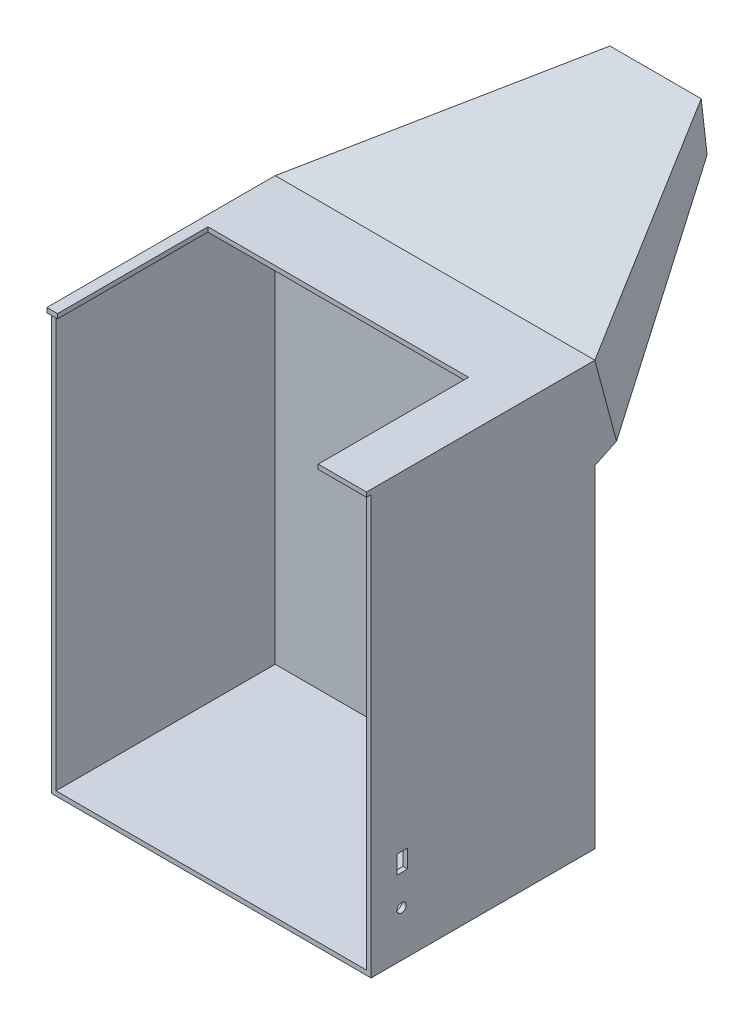
ISO-10303-21;
HEADER;
FILE_DESCRIPTION(('STEP AP214'),'2;1');
FILE_NAME('part.step','',(''),(''),'','','');
FILE_SCHEMA(('AUTOMOTIVE_DESIGN { 1 0 10303 214 1 1 1 1 }'));
ENDSEC;
DATA;
#1=APPLICATION_CONTEXT('core data for automotive mechanical design processes');
#2=APPLICATION_PROTOCOL_DEFINITION('international standard','automotive_design',2000,#1);
#3=PRODUCT_CONTEXT('',#1,'mechanical');
#4=PRODUCT('Part','Part','',(#3));
#5=PRODUCT_RELATED_PRODUCT_CATEGORY('part','',(#4));
#6=PRODUCT_DEFINITION_FORMATION('','',#4);
#7=PRODUCT_DEFINITION_CONTEXT('part definition',#1,'design');
#8=PRODUCT_DEFINITION('design','',#6,#7);
#9=PRODUCT_DEFINITION_SHAPE('','',#8);
#10=(LENGTH_UNIT() NAMED_UNIT(*) SI_UNIT(.MILLI.,.METRE.));
#11=(NAMED_UNIT(*) PLANE_ANGLE_UNIT() SI_UNIT($,.RADIAN.));
#12=(NAMED_UNIT(*) SI_UNIT($,.STERADIAN.) SOLID_ANGLE_UNIT());
#13=UNCERTAINTY_MEASURE_WITH_UNIT(LENGTH_MEASURE(1.E-05),#10,'distance_accuracy_value','');
#14=(GEOMETRIC_REPRESENTATION_CONTEXT(3) GLOBAL_UNCERTAINTY_ASSIGNED_CONTEXT((#13)) GLOBAL_UNIT_ASSIGNED_CONTEXT((#10,
#11,#12)) REPRESENTATION_CONTEXT('',''));
#15=CARTESIAN_POINT('',(0.,0.,0.));
#16=DIRECTION('',(0.,0.,1.));
#17=DIRECTION('',(1.,0.,0.));
#18=AXIS2_PLACEMENT_3D('',#15,#16,#17);
#19=CARTESIAN_POINT('',(-55.1888092698929,275.,-87.4251345332221));
#20=DIRECTION('',(1.,0.,0.));
#21=DIRECTION('',(0.,0.,-1.));
#22=AXIS2_PLACEMENT_3D('',#19,#20,#21);
#23=PLANE('',#22);
#24=DIRECTION('',(0.,0.,1.));
#25=VECTOR('',#24,1.);
#26=CARTESIAN_POINT('',(-55.1888092698929,278.,62.5748654667794));
#27=LINE('',#26,#25);
#28=CARTESIAN_POINT('',(-55.1888092698929,278.,-87.425134533222));
#29=VERTEX_POINT('',#28);
#30=CARTESIAN_POINT('',(-55.1888092698929,278.,62.5748654667794));
#31=VERTEX_POINT('',#30);
#32=EDGE_CURVE('E250',#29,#31,#27,.T.);
#33=ORIENTED_EDGE('',*,*,#32,.F.);
#34=DIRECTION('',(0.,0.965925826289068,0.258819045102521));
#35=VECTOR('',#34,1.);
#36=CARTESIAN_POINT('',(-55.1888092698929,75.1555764792956,-141.777134004752));
#37=LINE('',#36,#35);
#38=CARTESIAN_POINT('',(-55.1888092698929,224.774397794057,-101.686891660965));
#39=VERTEX_POINT('',#38);
#40=EDGE_CURVE('E224',#39,#29,#37,.T.);
#41=ORIENTED_EDGE('',*,*,#40,.F.);
#42=DIRECTION('',(0.,-0.429060078344727,0.903275954053254));
#43=VECTOR('',#42,1.);
#44=CARTESIAN_POINT('',(-55.1888092698929,286.822856765378,-232.314008476582));
#45=LINE('',#44,#43);
#46=CARTESIAN_POINT('',(-55.1888092698929,218.,-87.425134533222));
#47=VERTEX_POINT('',#46);
#48=EDGE_CURVE('E235',#39,#47,#45,.T.);
#49=ORIENTED_EDGE('',*,*,#48,.T.);
#50=DIRECTION('',(0.,-1.,0.));
#51=VECTOR('',#50,1.);
#52=CARTESIAN_POINT('',(-55.1888092698929,275.,-87.4251345332221));
#53=LINE('',#52,#51);
#54=CARTESIAN_POINT('',(-55.1888092698929,0.,-87.4251345332221));
#55=VERTEX_POINT('',#54);
#56=EDGE_CURVE('E346',#47,#55,#53,.T.);
#57=ORIENTED_EDGE('',*,*,#56,.T.);
#58=DIRECTION('',(0.,0.,1.));
#59=VECTOR('',#58,1.);
#60=CARTESIAN_POINT('',(-55.1888092698929,0.,-87.4251345332221));
#61=LINE('',#60,#59);
#62=CARTESIAN_POINT('',(-55.1888092698928,0.,59.5748654667779));
#63=VERTEX_POINT('',#62);
#64=EDGE_CURVE('E329',#55,#63,#61,.T.);
#65=ORIENTED_EDGE('',*,*,#64,.T.);
#66=DIRECTION('',(0.,-1.,0.));
#67=VECTOR('',#66,1.);
#68=CARTESIAN_POINT('',(-55.1888092698928,275.,59.5748654667779));
#69=LINE('',#68,#67);
#70=CARTESIAN_POINT('',(-55.1888092698929,275.,59.5748654667779));
#71=VERTEX_POINT('',#70);
#72=EDGE_CURVE('E293',#71,#63,#69,.T.);
#73=ORIENTED_EDGE('',*,*,#72,.F.);
#74=DIRECTION('',(0.,0.,1.));
#75=VECTOR('',#74,1.);
#76=CARTESIAN_POINT('',(-55.1888092698929,275.,62.5748654667794));
#77=LINE('',#76,#75);
#78=CARTESIAN_POINT('',(-55.1888092698929,275.,62.5748654667794));
#79=VERTEX_POINT('',#78);
#80=EDGE_CURVE('E265',#71,#79,#77,.T.);
#81=ORIENTED_EDGE('',*,*,#80,.T.);
#82=DIRECTION('',(0.,-1.,0.));
#83=VECTOR('',#82,1.);
#84=CARTESIAN_POINT('',(-55.1888092698929,278.,62.5748654667794));
#85=LINE('',#84,#83);
#86=EDGE_CURVE('E290',#31,#79,#85,.T.);
#87=ORIENTED_EDGE('',*,*,#86,.F.);
#88=EDGE_LOOP('',(#33,#41,#49,#57,#65,#73,#81,#87));
#89=FACE_BOUND('',#88,.T.);
#90=ADVANCED_FACE('F35',(#89),#23,.F.);
#91=CARTESIAN_POINT('',(154.811190730107,275.,-87.4251345332221));
#92=DIRECTION('',(-1.,0.,0.));
#93=DIRECTION('',(0.,0.,1.));
#94=AXIS2_PLACEMENT_3D('',#91,#92,#93);
#95=PLANE('',#94);
#96=DIRECTION('',(0.,0.,-1.));
#97=VECTOR('',#96,1.);
#98=CARTESIAN_POINT('',(154.811190730107,50.,42.5748654667779));
#99=LINE('',#98,#97);
#100=CARTESIAN_POINT('',(154.811190730107,50.,42.5748654667779));
#101=VERTEX_POINT('',#100);
#102=CARTESIAN_POINT('',(154.811190730107,50.,35.5748654667779));
#103=VERTEX_POINT('',#102);
#104=EDGE_CURVE('E195',#101,#103,#99,.T.);
#105=ORIENTED_EDGE('',*,*,#104,.F.);
#106=DIRECTION('',(0.,-1.,0.));
#107=VECTOR('',#106,1.);
#108=CARTESIAN_POINT('',(154.811190730107,62.,42.5748654667779));
#109=LINE('',#108,#107);
#110=CARTESIAN_POINT('',(154.811190730107,62.,42.5748654667779));
#111=VERTEX_POINT('',#110);
#112=EDGE_CURVE('E49',#111,#101,#109,.T.);
#113=ORIENTED_EDGE('',*,*,#112,.F.);
#114=DIRECTION('',(0.,0.,1.));
#115=VECTOR('',#114,1.);
#116=CARTESIAN_POINT('',(154.811190730107,62.,42.5748654667779));
#117=LINE('',#116,#115);
#118=CARTESIAN_POINT('',(154.811190730107,62.,35.5748654667779));
#119=VERTEX_POINT('',#118);
#120=EDGE_CURVE('E202',#119,#111,#117,.T.);
#121=ORIENTED_EDGE('',*,*,#120,.F.);
#122=DIRECTION('',(0.,1.,0.));
#123=VECTOR('',#122,1.);
#124=CARTESIAN_POINT('',(154.811190730107,62.,35.5748654667779));
#125=LINE('',#124,#123);
#126=EDGE_CURVE('E186',#103,#119,#125,.T.);
#127=ORIENTED_EDGE('',*,*,#126,.F.);
#128=EDGE_LOOP('',(#105,#113,#121,#127));
#129=FACE_BOUND('',#128,.T.);
#130=CARTESIAN_POINT('',(154.811190730107,30.,39.5748654667779));
#131=DIRECTION('',(1.,0.,0.));
#132=DIRECTION('',(0.,0.,-1.));
#133=AXIS2_PLACEMENT_3D('',#130,#131,#132);
#134=CIRCLE('',#133,3.);
#135=CARTESIAN_POINT('',(154.811190730107,30.,36.5748654667779));
#136=VERTEX_POINT('',#135);
#137=EDGE_CURVE('E209',#136,#136,#134,.T.);
#138=ORIENTED_EDGE('',*,*,#137,.F.);
#139=EDGE_LOOP('',(#138));
#140=FACE_BOUND('',#139,.T.);
#141=DIRECTION('',(0.,0.429060078344727,-0.903275954053254));
#142=VECTOR('',#141,1.);
#143=CARTESIAN_POINT('',(154.811190730107,286.822856765378,-232.314008476582));
#144=LINE('',#143,#142);
#145=CARTESIAN_POINT('',(154.811190730107,218.,-87.4251345332221));
#146=VERTEX_POINT('',#145);
#147=CARTESIAN_POINT('',(154.811190730107,224.774397794057,-101.686891660965));
#148=VERTEX_POINT('',#147);
#149=EDGE_CURVE('E228',#146,#148,#144,.T.);
#150=ORIENTED_EDGE('',*,*,#149,.T.);
#151=DIRECTION('',(0.,0.965925826289068,0.258819045102521));
#152=VECTOR('',#151,1.);
#153=CARTESIAN_POINT('',(154.811190730107,75.1555764792956,-141.777134004752));
#154=LINE('',#153,#152);
#155=CARTESIAN_POINT('',(154.811190730107,278.,-87.425134533222));
#156=VERTEX_POINT('',#155);
#157=EDGE_CURVE('E217',#148,#156,#154,.T.);
#158=ORIENTED_EDGE('',*,*,#157,.T.);
#159=DIRECTION('',(0.,0.,-1.));
#160=VECTOR('',#159,1.);
#161=CARTESIAN_POINT('',(154.811190730106,278.,62.5748654667794));
#162=LINE('',#161,#160);
#163=CARTESIAN_POINT('',(154.811190730106,278.,62.5748654667794));
#164=VERTEX_POINT('',#163);
#165=EDGE_CURVE('E243',#164,#156,#162,.T.);
#166=ORIENTED_EDGE('',*,*,#165,.F.);
#167=DIRECTION('',(0.,-1.,0.));
#168=VECTOR('',#167,1.);
#169=CARTESIAN_POINT('',(154.811190730106,278.,62.5748654667794));
#170=LINE('',#169,#168);
#171=CARTESIAN_POINT('',(154.811190730106,275.,62.5748654667794));
#172=VERTEX_POINT('',#171);
#173=EDGE_CURVE('E262',#164,#172,#170,.T.);
#174=ORIENTED_EDGE('',*,*,#173,.T.);
#175=DIRECTION('',(0.,0.,-1.));
#176=VECTOR('',#175,1.);
#177=CARTESIAN_POINT('',(154.811190730106,275.,62.5748654667794));
#178=LINE('',#177,#176);
#179=CARTESIAN_POINT('',(154.811190730106,275.,59.5748654667779));
#180=VERTEX_POINT('',#179);
#181=EDGE_CURVE('E242',#172,#180,#178,.T.);
#182=ORIENTED_EDGE('',*,*,#181,.T.);
#183=DIRECTION('',(0.,1.,0.));
#184=VECTOR('',#183,1.);
#185=CARTESIAN_POINT('',(154.811190730107,275.,59.5748654667779));
#186=LINE('',#185,#184);
#187=CARTESIAN_POINT('',(154.811190730107,0.,59.5748654667779));
#188=VERTEX_POINT('',#187);
#189=EDGE_CURVE('E297',#188,#180,#186,.T.);
#190=ORIENTED_EDGE('',*,*,#189,.F.);
#191=DIRECTION('',(0.,0.,-1.));
#192=VECTOR('',#191,1.);
#193=CARTESIAN_POINT('',(154.811190730107,0.,-87.4251345332221));
#194=LINE('',#193,#192);
#195=CARTESIAN_POINT('',(154.811190730107,0.,-87.4251345332221));
#196=VERTEX_POINT('',#195);
#197=EDGE_CURVE('E340',#188,#196,#194,.T.);
#198=ORIENTED_EDGE('',*,*,#197,.T.);
#199=DIRECTION('',(0.,-1.,0.));
#200=VECTOR('',#199,1.);
#201=CARTESIAN_POINT('',(154.811190730107,275.,-87.4251345332221));
#202=LINE('',#201,#200);
#203=EDGE_CURVE('E348',#146,#196,#202,.T.);
#204=ORIENTED_EDGE('',*,*,#203,.F.);
#205=EDGE_LOOP('',(#150,#158,#166,#174,#182,#190,#198,#204));
#206=FACE_BOUND('',#205,.T.);
#207=ADVANCED_FACE('F199',(#129,#140,#206),#95,.F.);
#208=CARTESIAN_POINT('',(0.,0.,0.));
#209=DIRECTION('',(0.,1.,0.));
#210=DIRECTION('',(0.,0.,1.));
#211=AXIS2_PLACEMENT_3D('',#208,#209,#210);
#212=PLANE('',#211);
#213=DIRECTION('',(1.,0.,0.));
#214=VECTOR('',#213,1.);
#215=CARTESIAN_POINT('',(-55.1888092698928,0.,59.5748654667779));
#216=LINE('',#215,#214);
#217=EDGE_CURVE('E295',#63,#188,#216,.T.);
#218=ORIENTED_EDGE('',*,*,#217,.F.);
#219=ORIENTED_EDGE('',*,*,#64,.F.);
#220=DIRECTION('',(-1.,0.,0.));
#221=VECTOR('',#220,1.);
#222=CARTESIAN_POINT('',(-55.1888092698929,0.,-87.4251345332221));
#223=LINE('',#222,#221);
#224=EDGE_CURVE('E343',#196,#55,#223,.T.);
#225=ORIENTED_EDGE('',*,*,#224,.F.);
#226=ORIENTED_EDGE('',*,*,#197,.F.);
#227=EDGE_LOOP('',(#218,#219,#225,#226));
#228=FACE_BOUND('',#227,.T.);
#229=ADVANCED_FACE('F384',(#228),#212,.F.);
#230=CARTESIAN_POINT('',(-55.1888092698929,275.,-87.4251345332221));
#231=DIRECTION('',(0.,0.,1.));
#232=DIRECTION('',(1.,0.,0.));
#233=AXIS2_PLACEMENT_3D('',#230,#231,#232);
#234=PLANE('',#233);
#235=ORIENTED_EDGE('',*,*,#56,.F.);
#236=DIRECTION('',(1.,0.,0.));
#237=VECTOR('',#236,1.);
#238=CARTESIAN_POINT('',(-230.570515305173,218.,-87.425134533222));
#239=LINE('',#238,#237);
#240=EDGE_CURVE('E231',#47,#146,#239,.T.);
#241=ORIENTED_EDGE('',*,*,#240,.T.);
#242=ORIENTED_EDGE('',*,*,#203,.T.);
#243=ORIENTED_EDGE('',*,*,#224,.T.);
#244=EDGE_LOOP('',(#235,#241,#242,#243));
#245=FACE_BOUND('',#244,.T.);
#246=ADVANCED_FACE('F417',(#245),#234,.F.);
#247=CARTESIAN_POINT('',(-52.1888092698929,3.,-84.4251345332221));
#248=DIRECTION('',(-1.,0.,0.));
#249=DIRECTION('',(0.,0.,1.));
#250=AXIS2_PLACEMENT_3D('',#247,#248,#249);
#251=PLANE('',#250);
#252=DIRECTION('',(0.,0.,1.));
#253=VECTOR('',#252,1.);
#254=CARTESIAN_POINT('',(-52.1888092698929,275.,-84.4251345332221));
#255=LINE('',#254,#253);
#256=CARTESIAN_POINT('',(-52.1888092698929,275.,-84.4251345332221));
#257=VERTEX_POINT('',#256);
#258=CARTESIAN_POINT('',(-52.1888092698928,275.,59.5748654667779));
#259=VERTEX_POINT('',#258);
#260=EDGE_CURVE('E304',#257,#259,#255,.T.);
#261=ORIENTED_EDGE('',*,*,#260,.T.);
#262=DIRECTION('',(0.,1.,0.));
#263=VECTOR('',#262,1.);
#264=CARTESIAN_POINT('',(-52.1888092698928,3.,59.5748654667779));
#265=LINE('',#264,#263);
#266=CARTESIAN_POINT('',(-52.1888092698929,3.,59.5748654667779));
#267=VERTEX_POINT('',#266);
#268=EDGE_CURVE('E318',#267,#259,#265,.T.);
#269=ORIENTED_EDGE('',*,*,#268,.F.);
#270=DIRECTION('',(0.,0.,1.));
#271=VECTOR('',#270,1.);
#272=CARTESIAN_POINT('',(-52.1888092698929,3.,-84.4251345332221));
#273=LINE('',#272,#271);
#274=CARTESIAN_POINT('',(-52.1888092698929,3.,-84.4251345332221));
#275=VERTEX_POINT('',#274);
#276=EDGE_CURVE('E305',#275,#267,#273,.T.);
#277=ORIENTED_EDGE('',*,*,#276,.F.);
#278=DIRECTION('',(0.,1.,0.));
#279=VECTOR('',#278,1.);
#280=CARTESIAN_POINT('',(-52.1888092698929,3.,-84.4251345332221));
#281=LINE('',#280,#279);
#282=EDGE_CURVE('E326',#275,#257,#281,.T.);
#283=ORIENTED_EDGE('',*,*,#282,.T.);
#284=EDGE_LOOP('',(#261,#269,#277,#283));
#285=FACE_BOUND('',#284,.T.);
#286=ADVANCED_FACE('F441',(#285),#251,.F.);
#287=CARTESIAN_POINT('',(-52.1888092698929,3.,-84.4251345332221));
#288=DIRECTION('',(0.,0.,-1.));
#289=DIRECTION('',(-1.,0.,0.));
#290=AXIS2_PLACEMENT_3D('',#287,#288,#289);
#291=PLANE('',#290);
#292=DIRECTION('',(-1.,0.,0.));
#293=VECTOR('',#292,1.);
#294=CARTESIAN_POINT('',(-52.1888092698929,275.,-84.4251345332221));
#295=LINE('',#294,#293);
#296=CARTESIAN_POINT('',(151.811190730107,275.,-84.4251345332221));
#297=VERTEX_POINT('',#296);
#298=EDGE_CURVE('E309',#297,#257,#295,.T.);
#299=ORIENTED_EDGE('',*,*,#298,.T.);
#300=ORIENTED_EDGE('',*,*,#282,.F.);
#301=DIRECTION('',(-1.,0.,0.));
#302=VECTOR('',#301,1.);
#303=CARTESIAN_POINT('',(-52.1888092698929,3.,-84.4251345332221));
#304=LINE('',#303,#302);
#305=CARTESIAN_POINT('',(151.811190730107,3.,-84.4251345332221));
#306=VERTEX_POINT('',#305);
#307=EDGE_CURVE('E315',#306,#275,#304,.T.);
#308=ORIENTED_EDGE('',*,*,#307,.F.);
#309=DIRECTION('',(0.,1.,0.));
#310=VECTOR('',#309,1.);
#311=CARTESIAN_POINT('',(151.811190730107,3.,-84.4251345332221));
#312=LINE('',#311,#310);
#313=EDGE_CURVE('E330',#306,#297,#312,.T.);
#314=ORIENTED_EDGE('',*,*,#313,.T.);
#315=EDGE_LOOP('',(#299,#300,#308,#314));
#316=FACE_BOUND('',#315,.T.);
#317=ADVANCED_FACE('F494',(#316),#291,.F.);
#318=CARTESIAN_POINT('',(151.811190730107,3.,-84.4251345332221));
#319=DIRECTION('',(1.,0.,0.));
#320=DIRECTION('',(0.,0.,-1.));
#321=AXIS2_PLACEMENT_3D('',#318,#319,#320);
#322=PLANE('',#321);
#323=DIRECTION('',(0.,0.,1.));
#324=VECTOR('',#323,1.);
#325=CARTESIAN_POINT('',(151.811190730107,62.,-84.4251345332221));
#326=LINE('',#325,#324);
#327=CARTESIAN_POINT('',(151.811190730107,62.,35.5748654667779));
#328=VERTEX_POINT('',#327);
#329=CARTESIAN_POINT('',(151.811190730107,62.,42.5748654667779));
#330=VERTEX_POINT('',#329);
#331=EDGE_CURVE('E42',#328,#330,#326,.T.);
#332=ORIENTED_EDGE('',*,*,#331,.T.);
#333=DIRECTION('',(0.,-1.,0.));
#334=VECTOR('',#333,1.);
#335=CARTESIAN_POINT('',(151.811190730107,3.,42.5748654667779));
#336=LINE('',#335,#334);
#337=CARTESIAN_POINT('',(151.811190730107,50.,42.5748654667779));
#338=VERTEX_POINT('',#337);
#339=EDGE_CURVE('E11',#330,#338,#336,.T.);
#340=ORIENTED_EDGE('',*,*,#339,.T.);
#341=DIRECTION('',(0.,0.,-1.));
#342=VECTOR('',#341,1.);
#343=CARTESIAN_POINT('',(151.811190730107,50.,-84.4251345332221));
#344=LINE('',#343,#342);
#345=CARTESIAN_POINT('',(151.811190730107,50.,35.5748654667779));
#346=VERTEX_POINT('',#345);
#347=EDGE_CURVE('E354',#338,#346,#344,.T.);
#348=ORIENTED_EDGE('',*,*,#347,.T.);
#349=DIRECTION('',(0.,1.,0.));
#350=VECTOR('',#349,1.);
#351=CARTESIAN_POINT('',(151.811190730107,2.99999999999993,35.5748654667779));
#352=LINE('',#351,#350);
#353=EDGE_CURVE('E189',#346,#328,#352,.T.);
#354=ORIENTED_EDGE('',*,*,#353,.T.);
#355=EDGE_LOOP('',(#332,#340,#348,#354));
#356=FACE_BOUND('',#355,.T.);
#357=CARTESIAN_POINT('',(151.811190730107,30.,39.5748654667779));
#358=DIRECTION('',(1.,0.,0.));
#359=DIRECTION('',(0.,0.,-1.));
#360=AXIS2_PLACEMENT_3D('',#357,#358,#359);
#361=CIRCLE('',#360,3.);
#362=CARTESIAN_POINT('',(151.811190730107,30.,36.5748654667779));
#363=VERTEX_POINT('',#362);
#364=EDGE_CURVE('E214',#363,#363,#361,.T.);
#365=ORIENTED_EDGE('',*,*,#364,.T.);
#366=EDGE_LOOP('',(#365));
#367=FACE_BOUND('',#366,.T.);
#368=DIRECTION('',(0.,0.,-1.));
#369=VECTOR('',#368,1.);
#370=CARTESIAN_POINT('',(151.811190730107,275.,-84.4251345332221));
#371=LINE('',#370,#369);
#372=CARTESIAN_POINT('',(151.811190730107,275.,59.5748654667779));
#373=VERTEX_POINT('',#372);
#374=EDGE_CURVE('E321',#373,#297,#371,.T.);
#375=ORIENTED_EDGE('',*,*,#374,.T.);
#376=ORIENTED_EDGE('',*,*,#313,.F.);
#377=DIRECTION('',(0.,0.,-1.));
#378=VECTOR('',#377,1.);
#379=CARTESIAN_POINT('',(151.811190730107,3.,-84.4251345332221));
#380=LINE('',#379,#378);
#381=CARTESIAN_POINT('',(151.811190730107,3.,59.5748654667779));
#382=VERTEX_POINT('',#381);
#383=EDGE_CURVE('E312',#382,#306,#380,.T.);
#384=ORIENTED_EDGE('',*,*,#383,.F.);
#385=DIRECTION('',(0.,1.,0.));
#386=VECTOR('',#385,1.);
#387=CARTESIAN_POINT('',(151.811190730107,3.,59.5748654667779));
#388=LINE('',#387,#386);
#389=EDGE_CURVE('E333',#382,#373,#388,.T.);
#390=ORIENTED_EDGE('',*,*,#389,.T.);
#391=EDGE_LOOP('',(#375,#376,#384,#390));
#392=FACE_BOUND('',#391,.T.);
#393=ADVANCED_FACE('F360',(#356,#367,#392),#322,.F.);
#394=CARTESIAN_POINT('',(0.,3.,0.));
#395=DIRECTION('',(0.,1.,0.));
#396=DIRECTION('',(0.,0.,1.));
#397=AXIS2_PLACEMENT_3D('',#394,#395,#396);
#398=PLANE('',#397);
#399=ORIENTED_EDGE('',*,*,#276,.T.);
#400=DIRECTION('',(1.,0.,0.));
#401=VECTOR('',#400,1.);
#402=CARTESIAN_POINT('',(-52.1888092698928,3.,59.5748654667779));
#403=LINE('',#402,#401);
#404=EDGE_CURVE('E308',#267,#382,#403,.T.);
#405=ORIENTED_EDGE('',*,*,#404,.T.);
#406=ORIENTED_EDGE('',*,*,#383,.T.);
#407=ORIENTED_EDGE('',*,*,#307,.T.);
#408=EDGE_LOOP('',(#399,#405,#406,#407));
#409=FACE_BOUND('',#408,.T.);
#410=ADVANCED_FACE('F437',(#409),#398,.T.);
#411=CARTESIAN_POINT('',(0.,0.,59.5748654667779));
#412=DIRECTION('',(0.,0.,1.));
#413=DIRECTION('',(1.,0.,0.));
#414=AXIS2_PLACEMENT_3D('',#411,#412,#413);
#415=PLANE('',#414);
#416=ORIENTED_EDGE('',*,*,#268,.T.);
#417=DIRECTION('',(-1.,0.,0.));
#418=VECTOR('',#417,1.);
#419=CARTESIAN_POINT('',(-55.1888092698928,275.,59.5748654667779));
#420=LINE('',#419,#418);
#421=EDGE_CURVE('E300',#259,#71,#420,.T.);
#422=ORIENTED_EDGE('',*,*,#421,.T.);
#423=ORIENTED_EDGE('',*,*,#72,.T.);
#424=ORIENTED_EDGE('',*,*,#217,.T.);
#425=ORIENTED_EDGE('',*,*,#189,.T.);
#426=EDGE_CURVE('E301',#180,#373,#420,.T.);
#427=ORIENTED_EDGE('',*,*,#426,.T.);
#428=ORIENTED_EDGE('',*,*,#389,.F.);
#429=ORIENTED_EDGE('',*,*,#404,.F.);
#430=EDGE_LOOP('',(#416,#422,#423,#424,#425,#427,#428,#429));
#431=FACE_BOUND('',#430,.T.);
#432=ADVANCED_FACE('F424',(#431),#415,.T.);
#433=CARTESIAN_POINT('',(-48.1888092698929,278.,62.5748654667794));
#434=DIRECTION('',(0.,0.,-1.));
#435=DIRECTION('',(-1.,0.,0.));
#436=AXIS2_PLACEMENT_3D('',#433,#434,#435);
#437=PLANE('',#436);
#438=DIRECTION('',(1.,0.,0.));
#439=VECTOR('',#438,1.);
#440=CARTESIAN_POINT('',(-48.1888092698929,275.,62.5748654667794));
#441=LINE('',#440,#439);
#442=CARTESIAN_POINT('',(-48.1888092698929,275.,62.5748654667794));
#443=VERTEX_POINT('',#442);
#444=EDGE_CURVE('E267',#79,#443,#441,.T.);
#445=ORIENTED_EDGE('',*,*,#444,.T.);
#446=DIRECTION('',(0.,-1.,0.));
#447=VECTOR('',#446,1.);
#448=CARTESIAN_POINT('',(-48.1888092698929,278.,62.5748654667794));
#449=LINE('',#448,#447);
#450=CARTESIAN_POINT('',(-48.1888092698929,278.,62.5748654667794));
#451=VERTEX_POINT('',#450);
#452=EDGE_CURVE('E287',#451,#443,#449,.T.);
#453=ORIENTED_EDGE('',*,*,#452,.F.);
#454=DIRECTION('',(1.,0.,0.));
#455=VECTOR('',#454,1.);
#456=CARTESIAN_POINT('',(-48.1888092698929,278.,62.5748654667794));
#457=LINE('',#456,#455);
#458=EDGE_CURVE('E252',#31,#451,#457,.T.);
#459=ORIENTED_EDGE('',*,*,#458,.F.);
#460=ORIENTED_EDGE('',*,*,#86,.T.);
#461=EDGE_LOOP('',(#445,#453,#459,#460));
#462=FACE_BOUND('',#461,.T.);
#463=ADVANCED_FACE('F444',(#462),#437,.F.);
#464=CARTESIAN_POINT('',(-48.1888092698929,278.,-36.2308154703868));
#465=DIRECTION('',(-1.,0.,0.));
#466=DIRECTION('',(0.,0.,1.));
#467=AXIS2_PLACEMENT_3D('',#464,#465,#466);
#468=PLANE('',#467);
#469=DIRECTION('',(0.,0.,-1.));
#470=VECTOR('',#469,1.);
#471=CARTESIAN_POINT('',(-48.1888092698929,275.,-36.2308154703868));
#472=LINE('',#471,#470);
#473=CARTESIAN_POINT('',(-48.1888092698929,275.,-36.2308154703868));
#474=VERTEX_POINT('',#473);
#475=EDGE_CURVE('E269',#443,#474,#472,.T.);
#476=ORIENTED_EDGE('',*,*,#475,.T.);
#477=DIRECTION('',(0.,-1.,0.));
#478=VECTOR('',#477,1.);
#479=CARTESIAN_POINT('',(-48.1888092698929,278.,-36.2308154703868));
#480=LINE('',#479,#478);
#481=CARTESIAN_POINT('',(-48.1888092698929,278.,-36.2308154703868));
#482=VERTEX_POINT('',#481);
#483=EDGE_CURVE('E284',#482,#474,#480,.T.);
#484=ORIENTED_EDGE('',*,*,#483,.F.);
#485=DIRECTION('',(0.,0.,-1.));
#486=VECTOR('',#485,1.);
#487=CARTESIAN_POINT('',(-48.1888092698929,278.,-36.2308154703868));
#488=LINE('',#487,#486);
#489=EDGE_CURVE('E254',#451,#482,#488,.T.);
#490=ORIENTED_EDGE('',*,*,#489,.F.);
#491=ORIENTED_EDGE('',*,*,#452,.T.);
#492=EDGE_LOOP('',(#476,#484,#490,#491));
#493=FACE_BOUND('',#492,.T.);
#494=ADVANCED_FACE('F449',(#493),#468,.F.);
#495=CARTESIAN_POINT('',(123.063521965747,278.,-36.2308154703868));
#496=DIRECTION('',(0.,0.,-1.));
#497=DIRECTION('',(-1.,0.,0.));
#498=AXIS2_PLACEMENT_3D('',#495,#496,#497);
#499=PLANE('',#498);
#500=DIRECTION('',(1.,0.,0.));
#501=VECTOR('',#500,1.);
#502=CARTESIAN_POINT('',(123.063521965747,275.,-36.2308154703868));
#503=LINE('',#502,#501);
#504=CARTESIAN_POINT('',(123.063521965747,275.,-36.2308154703868));
#505=VERTEX_POINT('',#504);
#506=EDGE_CURVE('E271',#474,#505,#503,.T.);
#507=ORIENTED_EDGE('',*,*,#506,.T.);
#508=DIRECTION('',(0.,-1.,0.));
#509=VECTOR('',#508,1.);
#510=CARTESIAN_POINT('',(123.063521965747,278.,-36.2308154703868));
#511=LINE('',#510,#509);
#512=CARTESIAN_POINT('',(123.063521965747,278.,-36.2308154703868));
#513=VERTEX_POINT('',#512);
#514=EDGE_CURVE('E281',#513,#505,#511,.T.);
#515=ORIENTED_EDGE('',*,*,#514,.F.);
#516=DIRECTION('',(1.,0.,0.));
#517=VECTOR('',#516,1.);
#518=CARTESIAN_POINT('',(123.063521965747,278.,-36.2308154703868));
#519=LINE('',#518,#517);
#520=EDGE_CURVE('E256',#482,#513,#519,.T.);
#521=ORIENTED_EDGE('',*,*,#520,.F.);
#522=ORIENTED_EDGE('',*,*,#483,.T.);
#523=EDGE_LOOP('',(#507,#515,#521,#522));
#524=FACE_BOUND('',#523,.T.);
#525=ADVANCED_FACE('F453',(#524),#499,.F.);
#526=CARTESIAN_POINT('',(123.063521965747,278.,-36.2308154703868));
#527=DIRECTION('',(1.,0.,0.));
#528=DIRECTION('',(0.,0.,-1.));
#529=AXIS2_PLACEMENT_3D('',#526,#527,#528);
#530=PLANE('',#529);
#531=DIRECTION('',(0.,0.,1.));
#532=VECTOR('',#531,1.);
#533=CARTESIAN_POINT('',(123.063521965747,275.,-36.2308154703868));
#534=LINE('',#533,#532);
#535=CARTESIAN_POINT('',(123.063521965747,275.,62.5748654667794));
#536=VERTEX_POINT('',#535);
#537=EDGE_CURVE('E273',#505,#536,#534,.T.);
#538=ORIENTED_EDGE('',*,*,#537,.T.);
#539=DIRECTION('',(0.,-1.,0.));
#540=VECTOR('',#539,1.);
#541=CARTESIAN_POINT('',(123.063521965747,278.,62.5748654667794));
#542=LINE('',#541,#540);
#543=CARTESIAN_POINT('',(123.063521965747,278.,62.5748654667794));
#544=VERTEX_POINT('',#543);
#545=EDGE_CURVE('E278',#544,#536,#542,.T.);
#546=ORIENTED_EDGE('',*,*,#545,.F.);
#547=DIRECTION('',(0.,0.,1.));
#548=VECTOR('',#547,1.);
#549=CARTESIAN_POINT('',(123.063521965747,278.,-36.2308154703868));
#550=LINE('',#549,#548);
#551=EDGE_CURVE('E258',#513,#544,#550,.T.);
#552=ORIENTED_EDGE('',*,*,#551,.F.);
#553=ORIENTED_EDGE('',*,*,#514,.T.);
#554=EDGE_LOOP('',(#538,#546,#552,#553));
#555=FACE_BOUND('',#554,.T.);
#556=ADVANCED_FACE('F459',(#555),#530,.F.);
#557=CARTESIAN_POINT('',(154.811190730106,278.,62.5748654667794));
#558=DIRECTION('',(0.,0.,-1.));
#559=DIRECTION('',(-1.,0.,0.));
#560=AXIS2_PLACEMENT_3D('',#557,#558,#559);
#561=PLANE('',#560);
#562=DIRECTION('',(1.,0.,0.));
#563=VECTOR('',#562,1.);
#564=CARTESIAN_POINT('',(154.811190730106,275.,62.5748654667794));
#565=LINE('',#564,#563);
#566=EDGE_CURVE('E247',#536,#172,#565,.T.);
#567=ORIENTED_EDGE('',*,*,#566,.T.);
#568=ORIENTED_EDGE('',*,*,#173,.F.);
#569=DIRECTION('',(1.,0.,0.));
#570=VECTOR('',#569,1.);
#571=CARTESIAN_POINT('',(154.811190730106,278.,62.5748654667794));
#572=LINE('',#571,#570);
#573=EDGE_CURVE('E260',#544,#164,#572,.T.);
#574=ORIENTED_EDGE('',*,*,#573,.F.);
#575=ORIENTED_EDGE('',*,*,#545,.T.);
#576=EDGE_LOOP('',(#567,#568,#574,#575));
#577=FACE_BOUND('',#576,.T.);
#578=ADVANCED_FACE('F461',(#577),#561,.F.);
#579=CARTESIAN_POINT('',(0.,278.,0.));
#580=DIRECTION('',(0.,1.,0.));
#581=DIRECTION('',(0.,0.,1.));
#582=AXIS2_PLACEMENT_3D('',#579,#580,#581);
#583=PLANE('',#582);
#584=ORIENTED_EDGE('',*,*,#165,.T.);
#585=DIRECTION('',(-1.,0.,0.));
#586=VECTOR('',#585,1.);
#587=CARTESIAN_POINT('',(154.811190730106,278.,-87.4251345332221));
#588=LINE('',#587,#586);
#589=EDGE_CURVE('E246',#156,#29,#588,.T.);
#590=ORIENTED_EDGE('',*,*,#589,.T.);
#591=ORIENTED_EDGE('',*,*,#32,.T.);
#592=ORIENTED_EDGE('',*,*,#458,.T.);
#593=ORIENTED_EDGE('',*,*,#489,.T.);
#594=ORIENTED_EDGE('',*,*,#520,.T.);
#595=ORIENTED_EDGE('',*,*,#551,.T.);
#596=ORIENTED_EDGE('',*,*,#573,.T.);
#597=EDGE_LOOP('',(#584,#590,#591,#592,#593,#594,#595,#596));
#598=FACE_BOUND('',#597,.T.);
#599=ADVANCED_FACE('F391',(#598),#583,.T.);
#600=CARTESIAN_POINT('',(0.,275.,0.));
#601=DIRECTION('',(0.,1.,0.));
#602=DIRECTION('',(0.,0.,1.));
#603=AXIS2_PLACEMENT_3D('',#600,#601,#602);
#604=PLANE('',#603);
#605=ORIENTED_EDGE('',*,*,#421,.F.);
#606=ORIENTED_EDGE('',*,*,#260,.F.);
#607=ORIENTED_EDGE('',*,*,#298,.F.);
#608=ORIENTED_EDGE('',*,*,#374,.F.);
#609=ORIENTED_EDGE('',*,*,#426,.F.);
#610=ORIENTED_EDGE('',*,*,#181,.F.);
#611=ORIENTED_EDGE('',*,*,#566,.F.);
#612=ORIENTED_EDGE('',*,*,#537,.F.);
#613=ORIENTED_EDGE('',*,*,#506,.F.);
#614=ORIENTED_EDGE('',*,*,#475,.F.);
#615=ORIENTED_EDGE('',*,*,#444,.F.);
#616=ORIENTED_EDGE('',*,*,#80,.F.);
#617=EDGE_LOOP('',(#605,#606,#607,#608,#609,#610,#611,#612,#613,#614,#615,#616));
#618=FACE_BOUND('',#617,.T.);
#619=ADVANCED_FACE('F431',(#618),#604,.F.);
#620=CARTESIAN_POINT('',(-230.570515305173,278.,-87.425134533222));
#621=DIRECTION('',(0.,0.965925826289068,0.258819045102521));
#622=DIRECTION('',(0.,-0.258819045102521,0.965925826289068));
#623=AXIS2_PLACEMENT_3D('',#620,#621,#622);
#624=PLANE('',#623);
#625=DIRECTION('',(0.447213595499958,-0.231494791488329,0.863950323522004));
#626=VECTOR('',#625,1.);
#627=CARTESIAN_POINT('',(79.8111907301071,316.822856765378,-232.314008476582));
#628=LINE('',#627,#626);
#629=CARTESIAN_POINT('',(79.8111907301071,316.822856765378,-232.314008476582));
#630=VERTEX_POINT('',#629);
#631=EDGE_CURVE('E215',#630,#156,#628,.T.);
#632=ORIENTED_EDGE('',*,*,#631,.F.);
#633=DIRECTION('',(1.,0.,0.));
#634=VECTOR('',#633,1.);
#635=CARTESIAN_POINT('',(-230.570515305173,316.822856765378,-232.314008476582));
#636=LINE('',#635,#634);
#637=CARTESIAN_POINT('',(19.8111907301071,316.822856765378,-232.314008476582));
#638=VERTEX_POINT('',#637);
#639=EDGE_CURVE('E232',#638,#630,#636,.T.);
#640=ORIENTED_EDGE('',*,*,#639,.F.);
#641=DIRECTION('',(0.447213595499958,0.231494791488328,-0.863950323522004));
#642=VECTOR('',#641,1.);
#643=CARTESIAN_POINT('',(19.8111907301071,316.822856765378,-232.314008476582));
#644=LINE('',#643,#642);
#645=EDGE_CURVE('E222',#29,#638,#644,.T.);
#646=ORIENTED_EDGE('',*,*,#645,.F.);
#647=ORIENTED_EDGE('',*,*,#589,.F.);
#648=EDGE_LOOP('',(#632,#640,#646,#647));
#649=FACE_BOUND('',#648,.T.);
#650=ADVANCED_FACE('F398',(#649),#624,.T.);
#651=CARTESIAN_POINT('',(-230.570515305173,316.822856765378,-232.314008476582));
#652=DIRECTION('',(0.,0.,-1.));
#653=DIRECTION('',(-1.,0.,0.));
#654=AXIS2_PLACEMENT_3D('',#651,#652,#653);
#655=PLANE('',#654);
#656=DIRECTION('',(-0.128339346206567,0.99173031223981,0.));
#657=VECTOR('',#656,1.);
#658=CARTESIAN_POINT('',(74.6988974413967,356.327625718415,-232.314008476582));
#659=LINE('',#658,#657);
#660=CARTESIAN_POINT('',(83.6934764066449,286.822856765378,-232.314008476582));
#661=VERTEX_POINT('',#660);
#662=EDGE_CURVE('E220',#661,#630,#659,.T.);
#663=ORIENTED_EDGE('',*,*,#662,.F.);
#664=DIRECTION('',(1.,0.,0.));
#665=VECTOR('',#664,1.);
#666=CARTESIAN_POINT('',(-230.570515305173,286.822856765378,-232.314008476582));
#667=LINE('',#666,#665);
#668=CARTESIAN_POINT('',(15.9289050535694,286.822856765378,-232.314008476582));
#669=VERTEX_POINT('',#668);
#670=EDGE_CURVE('E236',#669,#661,#667,.T.);
#671=ORIENTED_EDGE('',*,*,#670,.F.);
#672=DIRECTION('',(-0.128339346206567,-0.99173031223981,0.));
#673=VECTOR('',#672,1.);
#674=CARTESIAN_POINT('',(15.6871567084805,284.954769005506,-232.314008476582));
#675=LINE('',#674,#673);
#676=EDGE_CURVE('E226',#638,#669,#675,.T.);
#677=ORIENTED_EDGE('',*,*,#676,.F.);
#678=ORIENTED_EDGE('',*,*,#639,.T.);
#679=EDGE_LOOP('',(#663,#671,#677,#678));
#680=FACE_BOUND('',#679,.T.);
#681=ADVANCED_FACE('F407',(#680),#655,.T.);
#682=CARTESIAN_POINT('',(-230.570515305173,286.822856765378,-232.314008476582));
#683=DIRECTION('',(0.,-0.903275954053254,-0.429060078344727));
#684=DIRECTION('',(0.,0.429060078344727,-0.903275954053254));
#685=AXIS2_PLACEMENT_3D('',#682,#683,#684);
#686=PLANE('',#685);
#687=DIRECTION('',(-0.441297954100899,0.385021625900655,-0.810564286960126));
#688=VECTOR('',#687,1.);
#689=CARTESIAN_POINT('',(22.4924859670616,340.219217720161,-344.726351919199));
#690=LINE('',#689,#688);
#691=EDGE_CURVE('E352',#148,#661,#690,.T.);
#692=ORIENTED_EDGE('',*,*,#691,.F.);
#693=ORIENTED_EDGE('',*,*,#149,.F.);
#694=ORIENTED_EDGE('',*,*,#240,.F.);
#695=ORIENTED_EDGE('',*,*,#48,.F.);
#696=DIRECTION('',(-0.441297954100898,-0.385021625900655,0.810564286960126));
#697=VECTOR('',#696,1.);
#698=CARTESIAN_POINT('',(-32.0753495432225,244.940323698434,-144.14107670404));
#699=LINE('',#698,#697);
#700=EDGE_CURVE('E350',#669,#39,#699,.T.);
#701=ORIENTED_EDGE('',*,*,#700,.F.);
#702=ORIENTED_EDGE('',*,*,#670,.T.);
#703=EDGE_LOOP('',(#692,#693,#694,#695,#701,#702));
#704=FACE_BOUND('',#703,.T.);
#705=ADVANCED_FACE('F410',(#704),#686,.T.);
#706=CARTESIAN_POINT('',(19.8111907301071,113.978433244674,-286.666007948112));
#707=DIRECTION('',(0.894427190999916,-0.115747395744164,0.431975161761002));
#708=DIRECTION('',(0.434898251147076,0.,-0.90047960062914));
#709=AXIS2_PLACEMENT_3D('',#706,#707,#708);
#710=PLANE('',#709);
#711=ORIENTED_EDGE('',*,*,#676,.T.);
#712=ORIENTED_EDGE('',*,*,#700,.T.);
#713=ORIENTED_EDGE('',*,*,#40,.T.);
#714=ORIENTED_EDGE('',*,*,#645,.T.);
#715=EDGE_LOOP('',(#711,#712,#713,#714));
#716=FACE_BOUND('',#715,.T.);
#717=ADVANCED_FACE('F402',(#716),#710,.F.);
#718=CARTESIAN_POINT('',(79.8111907301071,113.978433244674,-286.666007948112));
#719=DIRECTION('',(-0.894427190999916,-0.115747395744164,0.431975161761002));
#720=DIRECTION('',(0.434898251147076,0.,0.90047960062914));
#721=AXIS2_PLACEMENT_3D('',#718,#719,#720);
#722=PLANE('',#721);
#723=ORIENTED_EDGE('',*,*,#662,.T.);
#724=ORIENTED_EDGE('',*,*,#631,.T.);
#725=ORIENTED_EDGE('',*,*,#157,.F.);
#726=ORIENTED_EDGE('',*,*,#691,.T.);
#727=EDGE_LOOP('',(#723,#724,#725,#726));
#728=FACE_BOUND('',#727,.T.);
#729=ADVANCED_FACE('F374',(#728),#722,.F.);
#730=CARTESIAN_POINT('',(128.811190730107,30.,39.5748654667779));
#731=DIRECTION('',(1.,0.,0.));
#732=DIRECTION('',(0.,0.,-1.));
#733=AXIS2_PLACEMENT_3D('',#730,#731,#732);
#734=CYLINDRICAL_SURFACE('',#733,3.);
#735=ORIENTED_EDGE('',*,*,#137,.T.);
#736=EDGE_LOOP('',(#735));
#737=FACE_BOUND('',#736,.T.);
#738=ORIENTED_EDGE('',*,*,#364,.F.);
#739=EDGE_LOOP('',(#738));
#740=FACE_BOUND('',#739,.T.);
#741=ADVANCED_FACE('F367',(#737,#740),#734,.F.);
#742=CARTESIAN_POINT('',(128.811190730107,62.,42.5748654667779));
#743=DIRECTION('',(0.,0.,1.));
#744=DIRECTION('',(1.,0.,0.));
#745=AXIS2_PLACEMENT_3D('',#742,#743,#744);
#746=PLANE('',#745);
#747=DIRECTION('',(1.,0.,0.));
#748=VECTOR('',#747,1.);
#749=CARTESIAN_POINT('',(128.811190730107,62.,42.5748654667779));
#750=LINE('',#749,#748);
#751=EDGE_CURVE('E207',#330,#111,#750,.T.);
#752=ORIENTED_EDGE('',*,*,#751,.T.);
#753=ORIENTED_EDGE('',*,*,#112,.T.);
#754=DIRECTION('',(1.,0.,0.));
#755=VECTOR('',#754,1.);
#756=CARTESIAN_POINT('',(128.811190730107,50.,42.5748654667779));
#757=LINE('',#756,#755);
#758=EDGE_CURVE('E192',#338,#101,#757,.T.);
#759=ORIENTED_EDGE('',*,*,#758,.F.);
#760=ORIENTED_EDGE('',*,*,#339,.F.);
#761=EDGE_LOOP('',(#752,#753,#759,#760));
#762=FACE_BOUND('',#761,.T.);
#763=ADVANCED_FACE('F365',(#762),#746,.F.);
#764=CARTESIAN_POINT('',(128.811190730107,62.,42.5748654667779));
#765=DIRECTION('',(0.,1.,0.));
#766=DIRECTION('',(0.,0.,1.));
#767=AXIS2_PLACEMENT_3D('',#764,#765,#766);
#768=PLANE('',#767);
#769=DIRECTION('',(1.,0.,0.));
#770=VECTOR('',#769,1.);
#771=CARTESIAN_POINT('',(128.811190730107,62.,35.5748654667779));
#772=LINE('',#771,#770);
#773=EDGE_CURVE('E191',#328,#119,#772,.T.);
#774=ORIENTED_EDGE('',*,*,#773,.T.);
#775=ORIENTED_EDGE('',*,*,#120,.T.);
#776=ORIENTED_EDGE('',*,*,#751,.F.);
#777=ORIENTED_EDGE('',*,*,#331,.F.);
#778=EDGE_LOOP('',(#774,#775,#776,#777));
#779=FACE_BOUND('',#778,.T.);
#780=ADVANCED_FACE('F364',(#779),#768,.F.);
#781=CARTESIAN_POINT('',(128.811190730107,62.,35.5748654667779));
#782=DIRECTION('',(0.,0.,-1.));
#783=DIRECTION('',(0.,1.,0.));
#784=AXIS2_PLACEMENT_3D('',#781,#782,#783);
#785=PLANE('',#784);
#786=DIRECTION('',(1.,0.,0.));
#787=VECTOR('',#786,1.);
#788=CARTESIAN_POINT('',(128.811190730107,50.,35.5748654667779));
#789=LINE('',#788,#787);
#790=EDGE_CURVE('E57',#346,#103,#789,.T.);
#791=ORIENTED_EDGE('',*,*,#790,.T.);
#792=ORIENTED_EDGE('',*,*,#126,.T.);
#793=ORIENTED_EDGE('',*,*,#773,.F.);
#794=ORIENTED_EDGE('',*,*,#353,.F.);
#795=EDGE_LOOP('',(#791,#792,#793,#794));
#796=FACE_BOUND('',#795,.T.);
#797=ADVANCED_FACE('F183',(#796),#785,.F.);
#798=CARTESIAN_POINT('',(128.811190730107,50.,42.5748654667779));
#799=DIRECTION('',(0.,-1.,0.));
#800=DIRECTION('',(0.,0.,-1.));
#801=AXIS2_PLACEMENT_3D('',#798,#799,#800);
#802=PLANE('',#801);
#803=ORIENTED_EDGE('',*,*,#758,.T.);
#804=ORIENTED_EDGE('',*,*,#104,.T.);
#805=ORIENTED_EDGE('',*,*,#790,.F.);
#806=ORIENTED_EDGE('',*,*,#347,.F.);
#807=EDGE_LOOP('',(#803,#804,#805,#806));
#808=FACE_BOUND('',#807,.T.);
#809=ADVANCED_FACE('F196',(#808),#802,.F.);
#810=CLOSED_SHELL('',(#90,#207,#229,#246,#286,#317,#393,#410,#432,#463,#494,#525,#556,#578,#599,
#619,#650,#681,#705,#717,#729,#741,#763,#780,#797,#809));
#811=MANIFOLD_SOLID_BREP('B2',#810);
#812=ADVANCED_BREP_SHAPE_REPRESENTATION('',(#18,#811),#14);
#813=SHAPE_DEFINITION_REPRESENTATION(#9,#812);
ENDSEC;
END-ISO-10303-21;
